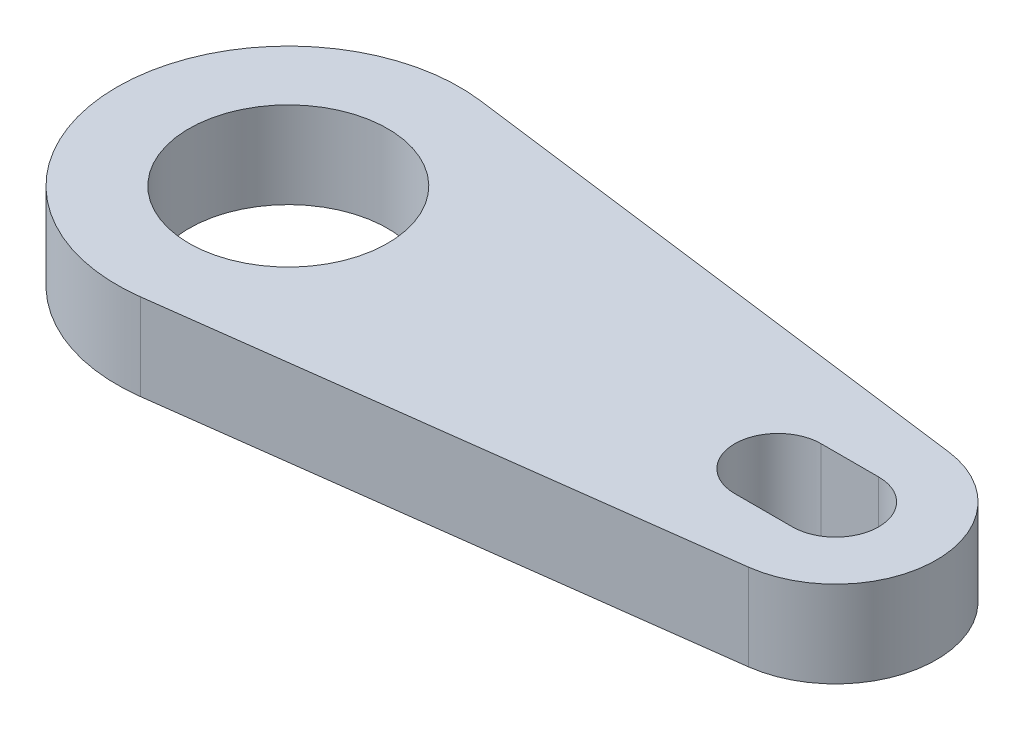
ISO-10303-21;
HEADER;
FILE_DESCRIPTION(('STEP AP214'),'2;1');
FILE_NAME('part.step','',(''),(''),'','','');
FILE_SCHEMA(('AUTOMOTIVE_DESIGN { 1 0 10303 214 1 1 1 1 }'));
ENDSEC;
DATA;
#1=APPLICATION_CONTEXT('core data for automotive mechanical design processes');
#2=APPLICATION_PROTOCOL_DEFINITION('international standard','automotive_design',2000,#1);
#3=PRODUCT_CONTEXT('',#1,'mechanical');
#4=PRODUCT('Part','Part','',(#3));
#5=PRODUCT_RELATED_PRODUCT_CATEGORY('part','',(#4));
#6=PRODUCT_DEFINITION_FORMATION('','',#4);
#7=PRODUCT_DEFINITION_CONTEXT('part definition',#1,'design');
#8=PRODUCT_DEFINITION('design','',#6,#7);
#9=PRODUCT_DEFINITION_SHAPE('','',#8);
#10=(LENGTH_UNIT() NAMED_UNIT(*) SI_UNIT(.MILLI.,.METRE.));
#11=(NAMED_UNIT(*) PLANE_ANGLE_UNIT() SI_UNIT($,.RADIAN.));
#12=(NAMED_UNIT(*) SI_UNIT($,.STERADIAN.) SOLID_ANGLE_UNIT());
#13=UNCERTAINTY_MEASURE_WITH_UNIT(LENGTH_MEASURE(1.E-05),#10,'distance_accuracy_value','');
#14=(GEOMETRIC_REPRESENTATION_CONTEXT(3) GLOBAL_UNCERTAINTY_ASSIGNED_CONTEXT((#13)) GLOBAL_UNIT_ASSIGNED_CONTEXT((#10,
#11,#12)) REPRESENTATION_CONTEXT('',''));
#15=CARTESIAN_POINT('',(0.,0.,0.));
#16=DIRECTION('',(0.,0.,1.));
#17=DIRECTION('',(1.,0.,0.));
#18=AXIS2_PLACEMENT_3D('',#15,#16,#17);
#19=CARTESIAN_POINT('',(19.,1.5,0.));
#20=DIRECTION('',(0.,1.,0.));
#21=DIRECTION('',(0.,0.,1.));
#22=AXIS2_PLACEMENT_3D('',#19,#20,#21);
#23=PLANE('',#22);
#24=CARTESIAN_POINT('',(19.,1.5,0.));
#25=DIRECTION('',(0.,1.,0.));
#26=DIRECTION('',(0.,0.,1.));
#27=AXIS2_PLACEMENT_3D('',#24,#25,#26);
#28=CIRCLE('',#27,3.5);
#29=CARTESIAN_POINT('',(19.4513157894737,1.5,3.47078003598208));
#30=VERTEX_POINT('',#29);
#31=CARTESIAN_POINT('',(19.4513157894737,1.5,-3.47078003598208));
#32=VERTEX_POINT('',#31);
#33=EDGE_CURVE('E165',#30,#32,#28,.T.);
#34=ORIENTED_EDGE('',*,*,#33,.T.);
#35=DIRECTION('',(-0.991651438852022,0.,-0.128947368421053));
#36=VECTOR('',#35,1.);
#37=CARTESIAN_POINT('',(19.4513157894737,1.5,-3.47078003598208));
#38=LINE('',#37,#36);
#39=CARTESIAN_POINT('',(0.767236842105263,1.5,-5.90032606116953));
#40=VERTEX_POINT('',#39);
#41=EDGE_CURVE('E169',#32,#40,#38,.T.);
#42=ORIENTED_EDGE('',*,*,#41,.T.);
#43=CARTESIAN_POINT('',(0.,1.5,0.));
#44=DIRECTION('',(0.,1.,0.));
#45=DIRECTION('',(0.,0.,1.));
#46=AXIS2_PLACEMENT_3D('',#43,#44,#45);
#47=CIRCLE('',#46,5.95);
#48=CARTESIAN_POINT('',(0.767236842105266,1.5,5.90032606116953));
#49=VERTEX_POINT('',#48);
#50=EDGE_CURVE('E173',#40,#49,#47,.T.);
#51=ORIENTED_EDGE('',*,*,#50,.T.);
#52=DIRECTION('',(0.991651438852022,0.,-0.128947368421053));
#53=VECTOR('',#52,1.);
#54=CARTESIAN_POINT('',(19.4513157894737,1.5,3.47078003598208));
#55=LINE('',#54,#53);
#56=EDGE_CURVE('E176',#49,#30,#55,.T.);
#57=ORIENTED_EDGE('',*,*,#56,.T.);
#58=EDGE_LOOP('',(#34,#42,#51,#57));
#59=FACE_BOUND('',#58,.T.);
#60=CARTESIAN_POINT('',(0.,1.5,0.));
#61=DIRECTION('',(0.,1.,0.));
#62=DIRECTION('',(0.,0.,1.));
#63=AXIS2_PLACEMENT_3D('',#60,#61,#62);
#64=CIRCLE('',#63,3.45);
#65=CARTESIAN_POINT('',(0.,1.5,3.45));
#66=VERTEX_POINT('',#65);
#67=EDGE_CURVE('E157',#66,#66,#64,.T.);
#68=ORIENTED_EDGE('',*,*,#67,.F.);
#69=EDGE_LOOP('',(#68));
#70=FACE_BOUND('',#69,.T.);
#71=DIRECTION('',(-1.,0.,0.));
#72=VECTOR('',#71,1.);
#73=CARTESIAN_POINT('',(19.,1.5,-1.5));
#74=LINE('',#73,#72);
#75=CARTESIAN_POINT('',(19.,1.5,-1.5));
#76=VERTEX_POINT('',#75);
#77=CARTESIAN_POINT('',(17.,1.5,-1.5));
#78=VERTEX_POINT('',#77);
#79=EDGE_CURVE('E118',#76,#78,#74,.T.);
#80=ORIENTED_EDGE('',*,*,#79,.F.);
#81=CARTESIAN_POINT('',(19.,1.5,0.));
#82=DIRECTION('',(0.,1.,0.));
#83=DIRECTION('',(0.,0.,1.));
#84=AXIS2_PLACEMENT_3D('',#81,#82,#83);
#85=CIRCLE('',#84,1.5);
#86=CARTESIAN_POINT('',(19.,1.5,1.5));
#87=VERTEX_POINT('',#86);
#88=EDGE_CURVE('E109',#87,#76,#85,.T.);
#89=ORIENTED_EDGE('',*,*,#88,.F.);
#90=DIRECTION('',(1.,0.,0.));
#91=VECTOR('',#90,1.);
#92=CARTESIAN_POINT('',(19.,1.5,1.5));
#93=LINE('',#92,#91);
#94=CARTESIAN_POINT('',(17.,1.5,1.5));
#95=VERTEX_POINT('',#94);
#96=EDGE_CURVE('E135',#95,#87,#93,.T.);
#97=ORIENTED_EDGE('',*,*,#96,.F.);
#98=CARTESIAN_POINT('',(17.,1.5,0.));
#99=DIRECTION('',(0.,1.,0.));
#100=DIRECTION('',(0.,0.,1.));
#101=AXIS2_PLACEMENT_3D('',#98,#99,#100);
#102=CIRCLE('',#101,1.5);
#103=EDGE_CURVE('E131',#78,#95,#102,.T.);
#104=ORIENTED_EDGE('',*,*,#103,.F.);
#105=EDGE_LOOP('',(#80,#89,#97,#104));
#106=FACE_BOUND('',#105,.T.);
#107=ADVANCED_FACE('F43',(#59,#70,#106),#23,.T.);
#108=CARTESIAN_POINT('',(19.,-1.5,0.));
#109=DIRECTION('',(0.,1.,0.));
#110=DIRECTION('',(0.,0.,1.));
#111=AXIS2_PLACEMENT_3D('',#108,#109,#110);
#112=PLANE('',#111);
#113=CARTESIAN_POINT('',(0.,-1.5,0.));
#114=DIRECTION('',(0.,1.,0.));
#115=DIRECTION('',(0.,0.,1.));
#116=AXIS2_PLACEMENT_3D('',#113,#114,#115);
#117=CIRCLE('',#116,3.45);
#118=CARTESIAN_POINT('',(0.,-1.5,3.45));
#119=VERTEX_POINT('',#118);
#120=EDGE_CURVE('E127',#119,#119,#117,.T.);
#121=ORIENTED_EDGE('',*,*,#120,.T.);
#122=EDGE_LOOP('',(#121));
#123=FACE_BOUND('',#122,.T.);
#124=CARTESIAN_POINT('',(19.,-1.5,0.));
#125=DIRECTION('',(0.,1.,0.));
#126=DIRECTION('',(0.,0.,1.));
#127=AXIS2_PLACEMENT_3D('',#124,#125,#126);
#128=CIRCLE('',#127,3.5);
#129=CARTESIAN_POINT('',(19.4513157894737,-1.5,3.47078003598208));
#130=VERTEX_POINT('',#129);
#131=CARTESIAN_POINT('',(19.4513157894737,-1.5,-3.47078003598208));
#132=VERTEX_POINT('',#131);
#133=EDGE_CURVE('E161',#130,#132,#128,.T.);
#134=ORIENTED_EDGE('',*,*,#133,.F.);
#135=DIRECTION('',(0.991651438852022,0.,-0.128947368421053));
#136=VECTOR('',#135,1.);
#137=CARTESIAN_POINT('',(19.4513157894737,-1.5,3.47078003598208));
#138=LINE('',#137,#136);
#139=CARTESIAN_POINT('',(0.767236842105266,-1.5,5.90032606116953));
#140=VERTEX_POINT('',#139);
#141=EDGE_CURVE('E170',#140,#130,#138,.T.);
#142=ORIENTED_EDGE('',*,*,#141,.F.);
#143=CARTESIAN_POINT('',(0.,-1.5,0.));
#144=DIRECTION('',(0.,1.,0.));
#145=DIRECTION('',(0.,0.,1.));
#146=AXIS2_PLACEMENT_3D('',#143,#144,#145);
#147=CIRCLE('',#146,5.95);
#148=CARTESIAN_POINT('',(0.767236842105263,-1.5,-5.90032606116953));
#149=VERTEX_POINT('',#148);
#150=EDGE_CURVE('E186',#149,#140,#147,.T.);
#151=ORIENTED_EDGE('',*,*,#150,.F.);
#152=DIRECTION('',(-0.991651438852022,0.,-0.128947368421053));
#153=VECTOR('',#152,1.);
#154=CARTESIAN_POINT('',(19.4513157894737,-1.5,-3.47078003598208));
#155=LINE('',#154,#153);
#156=EDGE_CURVE('E183',#132,#149,#155,.T.);
#157=ORIENTED_EDGE('',*,*,#156,.F.);
#158=EDGE_LOOP('',(#134,#142,#151,#157));
#159=FACE_BOUND('',#158,.T.);
#160=CARTESIAN_POINT('',(19.,-1.5,0.));
#161=DIRECTION('',(0.,1.,0.));
#162=DIRECTION('',(0.,0.,1.));
#163=AXIS2_PLACEMENT_3D('',#160,#161,#162);
#164=CIRCLE('',#163,1.5);
#165=CARTESIAN_POINT('',(19.,-1.5,1.5));
#166=VERTEX_POINT('',#165);
#167=CARTESIAN_POINT('',(19.,-1.5,-1.5));
#168=VERTEX_POINT('',#167);
#169=EDGE_CURVE('E67',#166,#168,#164,.T.);
#170=ORIENTED_EDGE('',*,*,#169,.T.);
#171=DIRECTION('',(-1.,0.,0.));
#172=VECTOR('',#171,1.);
#173=CARTESIAN_POINT('',(19.,-1.5,-1.5));
#174=LINE('',#173,#172);
#175=CARTESIAN_POINT('',(17.,-1.5,-1.5));
#176=VERTEX_POINT('',#175);
#177=EDGE_CURVE('E125',#168,#176,#174,.T.);
#178=ORIENTED_EDGE('',*,*,#177,.T.);
#179=CARTESIAN_POINT('',(17.,-1.5,0.));
#180=DIRECTION('',(0.,1.,0.));
#181=DIRECTION('',(0.,0.,1.));
#182=AXIS2_PLACEMENT_3D('',#179,#180,#181);
#183=CIRCLE('',#182,1.5);
#184=CARTESIAN_POINT('',(17.,-1.5,1.5));
#185=VERTEX_POINT('',#184);
#186=EDGE_CURVE('E144',#176,#185,#183,.T.);
#187=ORIENTED_EDGE('',*,*,#186,.T.);
#188=DIRECTION('',(1.,0.,0.));
#189=VECTOR('',#188,1.);
#190=CARTESIAN_POINT('',(19.,-1.5,1.5));
#191=LINE('',#190,#189);
#192=EDGE_CURVE('E119',#185,#166,#191,.T.);
#193=ORIENTED_EDGE('',*,*,#192,.T.);
#194=EDGE_LOOP('',(#170,#178,#187,#193));
#195=FACE_BOUND('',#194,.T.);
#196=ADVANCED_FACE('F209',(#123,#159,#195),#112,.F.);
#197=CARTESIAN_POINT('',(19.,1.5,0.));
#198=DIRECTION('',(0.,-1.,0.));
#199=DIRECTION('',(0.,0.,-1.));
#200=AXIS2_PLACEMENT_3D('',#197,#198,#199);
#201=CYLINDRICAL_SURFACE('',#200,3.5);
#202=ORIENTED_EDGE('',*,*,#133,.T.);
#203=DIRECTION('',(0.,-1.,0.));
#204=VECTOR('',#203,1.);
#205=CARTESIAN_POINT('',(19.4513157894737,1.5,-3.47078003598208));
#206=LINE('',#205,#204);
#207=EDGE_CURVE('E11',#32,#132,#206,.T.);
#208=ORIENTED_EDGE('',*,*,#207,.F.);
#209=ORIENTED_EDGE('',*,*,#33,.F.);
#210=DIRECTION('',(0.,-1.,0.));
#211=VECTOR('',#210,1.);
#212=CARTESIAN_POINT('',(19.4513157894737,1.5,3.47078003598208));
#213=LINE('',#212,#211);
#214=EDGE_CURVE('E179',#30,#130,#213,.T.);
#215=ORIENTED_EDGE('',*,*,#214,.T.);
#216=EDGE_LOOP('',(#202,#208,#209,#215));
#217=FACE_BOUND('',#216,.T.);
#218=ADVANCED_FACE('F45',(#217),#201,.T.);
#219=CARTESIAN_POINT('',(19.4513157894737,1.5,-3.47078003598208));
#220=DIRECTION('',(-0.128947368421053,0.,0.991651438852022));
#221=DIRECTION('',(0.991651438852022,0.,0.128947368421053));
#222=AXIS2_PLACEMENT_3D('',#219,#220,#221);
#223=PLANE('',#222);
#224=ORIENTED_EDGE('',*,*,#156,.T.);
#225=DIRECTION('',(0.,-1.,0.));
#226=VECTOR('',#225,1.);
#227=CARTESIAN_POINT('',(0.767236842105263,1.5,-5.90032606116953));
#228=LINE('',#227,#226);
#229=EDGE_CURVE('E52',#40,#149,#228,.T.);
#230=ORIENTED_EDGE('',*,*,#229,.F.);
#231=ORIENTED_EDGE('',*,*,#41,.F.);
#232=ORIENTED_EDGE('',*,*,#207,.T.);
#233=EDGE_LOOP('',(#224,#230,#231,#232));
#234=FACE_BOUND('',#233,.T.);
#235=ADVANCED_FACE('F220',(#234),#223,.F.);
#236=CARTESIAN_POINT('',(0.,1.5,0.));
#237=DIRECTION('',(0.,-1.,0.));
#238=DIRECTION('',(0.,0.,-1.));
#239=AXIS2_PLACEMENT_3D('',#236,#237,#238);
#240=CYLINDRICAL_SURFACE('',#239,5.95);
#241=ORIENTED_EDGE('',*,*,#150,.T.);
#242=DIRECTION('',(0.,-1.,0.));
#243=VECTOR('',#242,1.);
#244=CARTESIAN_POINT('',(0.767236842105266,1.5,5.90032606116953));
#245=LINE('',#244,#243);
#246=EDGE_CURVE('E194',#49,#140,#245,.T.);
#247=ORIENTED_EDGE('',*,*,#246,.F.);
#248=ORIENTED_EDGE('',*,*,#50,.F.);
#249=ORIENTED_EDGE('',*,*,#229,.T.);
#250=EDGE_LOOP('',(#241,#247,#248,#249));
#251=FACE_BOUND('',#250,.T.);
#252=ADVANCED_FACE('F203',(#251),#240,.T.);
#253=CARTESIAN_POINT('',(19.4513157894737,1.5,3.47078003598208));
#254=DIRECTION('',(-0.128947368421053,0.,-0.991651438852022));
#255=DIRECTION('',(-0.991651438852022,0.,0.128947368421053));
#256=AXIS2_PLACEMENT_3D('',#253,#254,#255);
#257=PLANE('',#256);
#258=ORIENTED_EDGE('',*,*,#141,.T.);
#259=ORIENTED_EDGE('',*,*,#214,.F.);
#260=ORIENTED_EDGE('',*,*,#56,.F.);
#261=ORIENTED_EDGE('',*,*,#246,.T.);
#262=EDGE_LOOP('',(#258,#259,#260,#261));
#263=FACE_BOUND('',#262,.T.);
#264=ADVANCED_FACE('F213',(#263),#257,.F.);
#265=CARTESIAN_POINT('',(0.,1.5,0.));
#266=DIRECTION('',(0.,-1.,0.));
#267=DIRECTION('',(0.,0.,-1.));
#268=AXIS2_PLACEMENT_3D('',#265,#266,#267);
#269=CYLINDRICAL_SURFACE('',#268,3.45);
#270=ORIENTED_EDGE('',*,*,#67,.T.);
#271=EDGE_LOOP('',(#270));
#272=FACE_BOUND('',#271,.T.);
#273=ORIENTED_EDGE('',*,*,#120,.F.);
#274=EDGE_LOOP('',(#273));
#275=FACE_BOUND('',#274,.T.);
#276=ADVANCED_FACE('F235',(#272,#275),#269,.F.);
#277=CARTESIAN_POINT('',(19.,1.5,0.));
#278=DIRECTION('',(0.,-1.,0.));
#279=DIRECTION('',(0.,0.,-1.));
#280=AXIS2_PLACEMENT_3D('',#277,#278,#279);
#281=CYLINDRICAL_SURFACE('',#280,1.5);
#282=ORIENTED_EDGE('',*,*,#169,.F.);
#283=DIRECTION('',(0.,-1.,0.));
#284=VECTOR('',#283,1.);
#285=CARTESIAN_POINT('',(19.,1.5,1.5));
#286=LINE('',#285,#284);
#287=EDGE_CURVE('E113',#87,#166,#286,.T.);
#288=ORIENTED_EDGE('',*,*,#287,.F.);
#289=ORIENTED_EDGE('',*,*,#88,.T.);
#290=DIRECTION('',(0.,-1.,0.));
#291=VECTOR('',#290,1.);
#292=CARTESIAN_POINT('',(19.,1.5,-1.5));
#293=LINE('',#292,#291);
#294=EDGE_CURVE('E112',#76,#168,#293,.T.);
#295=ORIENTED_EDGE('',*,*,#294,.T.);
#296=EDGE_LOOP('',(#282,#288,#289,#295));
#297=FACE_BOUND('',#296,.T.);
#298=ADVANCED_FACE('F111',(#297),#281,.F.);
#299=CARTESIAN_POINT('',(19.,1.5,-1.5));
#300=DIRECTION('',(0.,0.,1.));
#301=DIRECTION('',(1.,0.,0.));
#302=AXIS2_PLACEMENT_3D('',#299,#300,#301);
#303=PLANE('',#302);
#304=ORIENTED_EDGE('',*,*,#177,.F.);
#305=ORIENTED_EDGE('',*,*,#294,.F.);
#306=ORIENTED_EDGE('',*,*,#79,.T.);
#307=DIRECTION('',(0.,-1.,0.));
#308=VECTOR('',#307,1.);
#309=CARTESIAN_POINT('',(17.,1.5,-1.5));
#310=LINE('',#309,#308);
#311=EDGE_CURVE('E128',#78,#176,#310,.T.);
#312=ORIENTED_EDGE('',*,*,#311,.T.);
#313=EDGE_LOOP('',(#304,#305,#306,#312));
#314=FACE_BOUND('',#313,.T.);
#315=ADVANCED_FACE('F122',(#314),#303,.T.);
#316=CARTESIAN_POINT('',(17.,1.5,0.));
#317=DIRECTION('',(0.,-1.,0.));
#318=DIRECTION('',(0.,0.,-1.));
#319=AXIS2_PLACEMENT_3D('',#316,#317,#318);
#320=CYLINDRICAL_SURFACE('',#319,1.5);
#321=ORIENTED_EDGE('',*,*,#186,.F.);
#322=ORIENTED_EDGE('',*,*,#311,.F.);
#323=ORIENTED_EDGE('',*,*,#103,.T.);
#324=DIRECTION('',(0.,-1.,0.));
#325=VECTOR('',#324,1.);
#326=CARTESIAN_POINT('',(17.,1.5,1.5));
#327=LINE('',#326,#325);
#328=EDGE_CURVE('E59',#95,#185,#327,.T.);
#329=ORIENTED_EDGE('',*,*,#328,.T.);
#330=EDGE_LOOP('',(#321,#322,#323,#329));
#331=FACE_BOUND('',#330,.T.);
#332=ADVANCED_FACE('F252',(#331),#320,.F.);
#333=CARTESIAN_POINT('',(19.,1.5,1.5));
#334=DIRECTION('',(0.,0.,-1.));
#335=DIRECTION('',(-1.,0.,0.));
#336=AXIS2_PLACEMENT_3D('',#333,#334,#335);
#337=PLANE('',#336);
#338=ORIENTED_EDGE('',*,*,#192,.F.);
#339=ORIENTED_EDGE('',*,*,#328,.F.);
#340=ORIENTED_EDGE('',*,*,#96,.T.);
#341=ORIENTED_EDGE('',*,*,#287,.T.);
#342=EDGE_LOOP('',(#338,#339,#340,#341));
#343=FACE_BOUND('',#342,.T.);
#344=ADVANCED_FACE('F257',(#343),#337,.T.);
#345=CLOSED_SHELL('',(#107,#196,#218,#235,#252,#264,#276,#298,#315,#332,#344));
#346=MANIFOLD_SOLID_BREP('B2',#345);
#347=ADVANCED_BREP_SHAPE_REPRESENTATION('',(#18,#346),#14);
#348=SHAPE_DEFINITION_REPRESENTATION(#9,#347);
ENDSEC;
END-ISO-10303-21;
